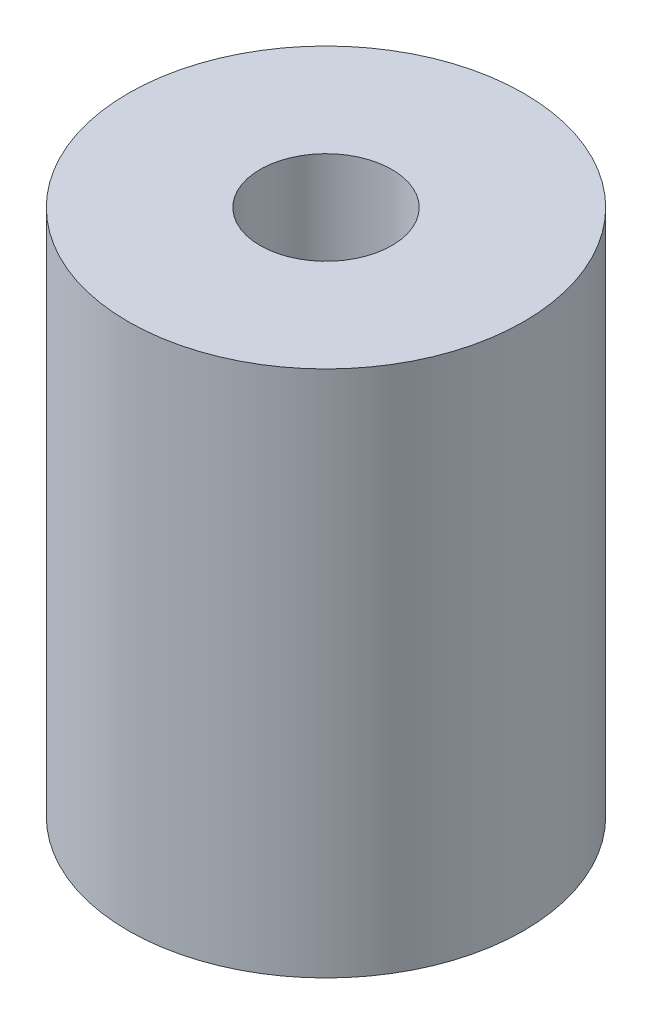
ISO-10303-21;
HEADER;
FILE_DESCRIPTION(('STEP AP214'),'2;1');
FILE_NAME('part.step','',(''),(''),'','','');
FILE_SCHEMA(('AUTOMOTIVE_DESIGN { 1 0 10303 214 1 1 1 1 }'));
ENDSEC;
DATA;
#1=APPLICATION_CONTEXT('core data for automotive mechanical design processes');
#2=APPLICATION_PROTOCOL_DEFINITION('international standard','automotive_design',2000,#1);
#3=PRODUCT_CONTEXT('',#1,'mechanical');
#4=PRODUCT('Part','Part','',(#3));
#5=PRODUCT_RELATED_PRODUCT_CATEGORY('part','',(#4));
#6=PRODUCT_DEFINITION_FORMATION('','',#4);
#7=PRODUCT_DEFINITION_CONTEXT('part definition',#1,'design');
#8=PRODUCT_DEFINITION('design','',#6,#7);
#9=PRODUCT_DEFINITION_SHAPE('','',#8);
#10=(LENGTH_UNIT() NAMED_UNIT(*) SI_UNIT(.MILLI.,.METRE.));
#11=(NAMED_UNIT(*) PLANE_ANGLE_UNIT() SI_UNIT($,.RADIAN.));
#12=(NAMED_UNIT(*) SI_UNIT($,.STERADIAN.) SOLID_ANGLE_UNIT());
#13=UNCERTAINTY_MEASURE_WITH_UNIT(LENGTH_MEASURE(1.E-05),#10,'distance_accuracy_value','');
#14=(GEOMETRIC_REPRESENTATION_CONTEXT(3) GLOBAL_UNCERTAINTY_ASSIGNED_CONTEXT((#13)) GLOBAL_UNIT_ASSIGNED_CONTEXT((#10,
#11,#12)) REPRESENTATION_CONTEXT('',''));
#15=CARTESIAN_POINT('',(0.,0.,0.));
#16=DIRECTION('',(0.,0.,1.));
#17=DIRECTION('',(1.,0.,0.));
#18=AXIS2_PLACEMENT_3D('',#15,#16,#17);
#19=CARTESIAN_POINT('',(0.,20.,0.));
#20=DIRECTION('',(0.,-1.,0.));
#21=DIRECTION('',(0.,0.,-1.));
#22=AXIS2_PLACEMENT_3D('',#19,#20,#21);
#23=CYLINDRICAL_SURFACE('',#22,7.5);
#24=CARTESIAN_POINT('',(0.,20.,0.));
#25=DIRECTION('',(0.,1.,0.));
#26=DIRECTION('',(0.,0.,1.));
#27=AXIS2_PLACEMENT_3D('',#24,#25,#26);
#28=CIRCLE('',#27,7.5);
#29=CARTESIAN_POINT('',(0.,20.,7.5));
#30=VERTEX_POINT('',#29);
#31=EDGE_CURVE('E10',#30,#30,#28,.T.);
#32=ORIENTED_EDGE('',*,*,#31,.F.);
#33=EDGE_LOOP('',(#32));
#34=FACE_BOUND('',#33,.T.);
#35=CARTESIAN_POINT('',(0.,0.,0.));
#36=DIRECTION('',(0.,1.,0.));
#37=DIRECTION('',(0.,0.,1.));
#38=AXIS2_PLACEMENT_3D('',#35,#36,#37);
#39=CIRCLE('',#38,7.5);
#40=CARTESIAN_POINT('',(0.,0.,7.5));
#41=VERTEX_POINT('',#40);
#42=EDGE_CURVE('E44',#41,#41,#39,.T.);
#43=ORIENTED_EDGE('',*,*,#42,.T.);
#44=EDGE_LOOP('',(#43));
#45=FACE_BOUND('',#44,.T.);
#46=ADVANCED_FACE('F41',(#34,#45),#23,.T.);
#47=CARTESIAN_POINT('',(0.,20.,0.));
#48=DIRECTION('',(0.,1.,0.));
#49=DIRECTION('',(0.,0.,1.));
#50=AXIS2_PLACEMENT_3D('',#47,#48,#49);
#51=PLANE('',#50);
#52=CARTESIAN_POINT('',(0.,20.,0.));
#53=DIRECTION('',(0.,1.,0.));
#54=DIRECTION('',(0.,0.,1.));
#55=AXIS2_PLACEMENT_3D('',#52,#53,#54);
#56=CIRCLE('',#55,2.5);
#57=CARTESIAN_POINT('',(0.,20.,2.5));
#58=VERTEX_POINT('',#57);
#59=EDGE_CURVE('E53',#58,#58,#56,.T.);
#60=ORIENTED_EDGE('',*,*,#59,.F.);
#61=EDGE_LOOP('',(#60));
#62=FACE_BOUND('',#61,.T.);
#63=ORIENTED_EDGE('',*,*,#31,.T.);
#64=EDGE_LOOP('',(#63));
#65=FACE_BOUND('',#64,.T.);
#66=ADVANCED_FACE('F84',(#62,#65),#51,.T.);
#67=CARTESIAN_POINT('',(0.,0.,0.));
#68=DIRECTION('',(0.,1.,0.));
#69=DIRECTION('',(0.,0.,1.));
#70=AXIS2_PLACEMENT_3D('',#67,#68,#69);
#71=PLANE('',#70);
#72=CARTESIAN_POINT('',(0.,0.,0.));
#73=DIRECTION('',(0.,-1.,0.));
#74=DIRECTION('',(0.,0.,-1.));
#75=AXIS2_PLACEMENT_3D('',#72,#73,#74);
#76=CIRCLE('',#75,4.);
#77=CARTESIAN_POINT('',(0.,0.,-4.));
#78=VERTEX_POINT('',#77);
#79=EDGE_CURVE('E63',#78,#78,#76,.T.);
#80=ORIENTED_EDGE('',*,*,#79,.F.);
#81=EDGE_LOOP('',(#80));
#82=FACE_BOUND('',#81,.T.);
#83=ORIENTED_EDGE('',*,*,#42,.F.);
#84=EDGE_LOOP('',(#83));
#85=FACE_BOUND('',#84,.T.);
#86=ADVANCED_FACE('F80',(#82,#85),#71,.F.);
#87=CARTESIAN_POINT('',(0.,10.,0.));
#88=DIRECTION('',(0.,1.,0.));
#89=DIRECTION('',(0.,0.,1.));
#90=AXIS2_PLACEMENT_3D('',#87,#88,#89);
#91=CYLINDRICAL_SURFACE('',#90,2.5);
#92=CARTESIAN_POINT('',(0.,10.,0.));
#93=DIRECTION('',(0.,1.,0.));
#94=DIRECTION('',(0.,0.,1.));
#95=AXIS2_PLACEMENT_3D('',#92,#93,#94);
#96=CIRCLE('',#95,2.5);
#97=CARTESIAN_POINT('',(0.,10.,2.5));
#98=VERTEX_POINT('',#97);
#99=EDGE_CURVE('E58',#98,#98,#96,.T.);
#100=ORIENTED_EDGE('',*,*,#99,.F.);
#101=EDGE_LOOP('',(#100));
#102=FACE_BOUND('',#101,.T.);
#103=ORIENTED_EDGE('',*,*,#59,.T.);
#104=EDGE_LOOP('',(#103));
#105=FACE_BOUND('',#104,.T.);
#106=ADVANCED_FACE('F83',(#102,#105),#91,.F.);
#107=CARTESIAN_POINT('',(0.,10.,0.));
#108=DIRECTION('',(0.,-1.,0.));
#109=DIRECTION('',(0.,0.,-1.));
#110=AXIS2_PLACEMENT_3D('',#107,#108,#109);
#111=PLANE('',#110);
#112=CARTESIAN_POINT('',(0.,10.,0.));
#113=DIRECTION('',(0.,-1.,0.));
#114=DIRECTION('',(0.,0.,-1.));
#115=AXIS2_PLACEMENT_3D('',#112,#113,#114);
#116=CIRCLE('',#115,4.);
#117=CARTESIAN_POINT('',(0.,10.,-4.));
#118=VERTEX_POINT('',#117);
#119=EDGE_CURVE('E62',#118,#118,#116,.T.);
#120=ORIENTED_EDGE('',*,*,#119,.T.);
#121=EDGE_LOOP('',(#120));
#122=FACE_BOUND('',#121,.T.);
#123=ORIENTED_EDGE('',*,*,#99,.T.);
#124=EDGE_LOOP('',(#123));
#125=FACE_BOUND('',#124,.T.);
#126=ADVANCED_FACE('F71',(#122,#125),#111,.T.);
#127=CARTESIAN_POINT('',(0.,10.,0.));
#128=DIRECTION('',(0.,-1.,0.));
#129=DIRECTION('',(0.,0.,-1.));
#130=AXIS2_PLACEMENT_3D('',#127,#128,#129);
#131=CYLINDRICAL_SURFACE('',#130,4.);
#132=ORIENTED_EDGE('',*,*,#119,.F.);
#133=EDGE_LOOP('',(#132));
#134=FACE_BOUND('',#133,.T.);
#135=ORIENTED_EDGE('',*,*,#79,.T.);
#136=EDGE_LOOP('',(#135));
#137=FACE_BOUND('',#136,.T.);
#138=ADVANCED_FACE('F74',(#134,#137),#131,.F.);
#139=CLOSED_SHELL('',(#46,#66,#86,#106,#126,#138));
#140=MANIFOLD_SOLID_BREP('B2',#139);
#141=ADVANCED_BREP_SHAPE_REPRESENTATION('',(#18,#140),#14);
#142=SHAPE_DEFINITION_REPRESENTATION(#9,#141);
ENDSEC;
END-ISO-10303-21;
